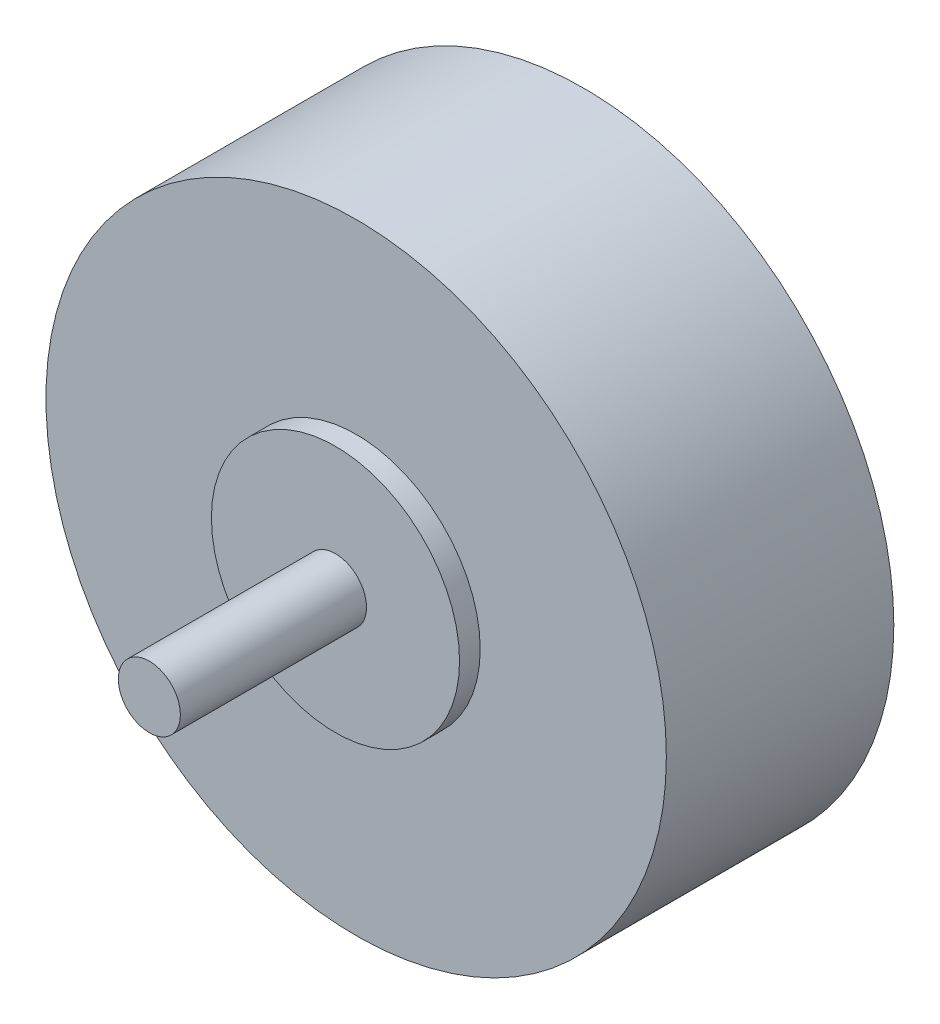
ISO-10303-21;
HEADER;
FILE_DESCRIPTION(('STEP AP214'),'2;1');
FILE_NAME('part.step','',(''),(''),'','','');
FILE_SCHEMA(('AUTOMOTIVE_DESIGN { 1 0 10303 214 1 1 1 1 }'));
ENDSEC;
DATA;
#1=APPLICATION_CONTEXT('core data for automotive mechanical design processes');
#2=APPLICATION_PROTOCOL_DEFINITION('international standard','automotive_design',2000,#1);
#3=PRODUCT_CONTEXT('',#1,'mechanical');
#4=PRODUCT('Part','Part','',(#3));
#5=PRODUCT_RELATED_PRODUCT_CATEGORY('part','',(#4));
#6=PRODUCT_DEFINITION_FORMATION('','',#4);
#7=PRODUCT_DEFINITION_CONTEXT('part definition',#1,'design');
#8=PRODUCT_DEFINITION('design','',#6,#7);
#9=PRODUCT_DEFINITION_SHAPE('','',#8);
#10=(LENGTH_UNIT() NAMED_UNIT(*) SI_UNIT(.MILLI.,.METRE.));
#11=(NAMED_UNIT(*) PLANE_ANGLE_UNIT() SI_UNIT($,.RADIAN.));
#12=(NAMED_UNIT(*) SI_UNIT($,.STERADIAN.) SOLID_ANGLE_UNIT());
#13=UNCERTAINTY_MEASURE_WITH_UNIT(LENGTH_MEASURE(1.E-05),#10,'distance_accuracy_value','');
#14=(GEOMETRIC_REPRESENTATION_CONTEXT(3) GLOBAL_UNCERTAINTY_ASSIGNED_CONTEXT((#13)) GLOBAL_UNIT_ASSIGNED_CONTEXT((#10,
#11,#12)) REPRESENTATION_CONTEXT('',''));
#15=CARTESIAN_POINT('',(0.,0.,0.));
#16=DIRECTION('',(0.,0.,1.));
#17=DIRECTION('',(1.,0.,0.));
#18=AXIS2_PLACEMENT_3D('',#15,#16,#17);
#19=CARTESIAN_POINT('',(0.,0.,5.5));
#20=DIRECTION('',(0.,0.,-1.));
#21=DIRECTION('',(-1.,0.,0.));
#22=AXIS2_PLACEMENT_3D('',#19,#20,#21);
#23=CYLINDRICAL_SURFACE('',#22,7.5);
#24=CARTESIAN_POINT('',(0.,0.,5.5));
#25=DIRECTION('',(0.,0.,1.));
#26=DIRECTION('',(1.,0.,0.));
#27=AXIS2_PLACEMENT_3D('',#24,#25,#26);
#28=CIRCLE('',#27,7.5);
#29=CARTESIAN_POINT('',(7.5,0.,5.5));
#30=VERTEX_POINT('',#29);
#31=EDGE_CURVE('E38',#30,#30,#28,.T.);
#32=ORIENTED_EDGE('',*,*,#31,.F.);
#33=EDGE_LOOP('',(#32));
#34=FACE_BOUND('',#33,.T.);
#35=CARTESIAN_POINT('',(0.,0.,0.));
#36=DIRECTION('',(0.,0.,1.));
#37=DIRECTION('',(1.,0.,0.));
#38=AXIS2_PLACEMENT_3D('',#35,#36,#37);
#39=CIRCLE('',#38,7.5);
#40=CARTESIAN_POINT('',(7.5,0.,0.));
#41=VERTEX_POINT('',#40);
#42=EDGE_CURVE('E42',#41,#41,#39,.T.);
#43=ORIENTED_EDGE('',*,*,#42,.T.);
#44=EDGE_LOOP('',(#43));
#45=FACE_BOUND('',#44,.T.);
#46=ADVANCED_FACE('F31',(#34,#45),#23,.T.);
#47=CARTESIAN_POINT('',(0.,0.,5.5));
#48=DIRECTION('',(0.,0.,1.));
#49=DIRECTION('',(1.,0.,0.));
#50=AXIS2_PLACEMENT_3D('',#47,#48,#49);
#51=PLANE('',#50);
#52=CARTESIAN_POINT('',(0.,0.,5.5));
#53=DIRECTION('',(0.,0.,1.));
#54=DIRECTION('',(1.,0.,0.));
#55=AXIS2_PLACEMENT_3D('',#52,#53,#54);
#56=CIRCLE('',#55,3.);
#57=CARTESIAN_POINT('',(3.,0.,5.5));
#58=VERTEX_POINT('',#57);
#59=EDGE_CURVE('E48',#58,#58,#56,.T.);
#60=ORIENTED_EDGE('',*,*,#59,.F.);
#61=EDGE_LOOP('',(#60));
#62=FACE_BOUND('',#61,.T.);
#63=ORIENTED_EDGE('',*,*,#31,.T.);
#64=EDGE_LOOP('',(#63));
#65=FACE_BOUND('',#64,.T.);
#66=ADVANCED_FACE('F85',(#62,#65),#51,.T.);
#67=CARTESIAN_POINT('',(0.,0.,0.));
#68=DIRECTION('',(0.,0.,1.));
#69=DIRECTION('',(1.,0.,0.));
#70=AXIS2_PLACEMENT_3D('',#67,#68,#69);
#71=PLANE('',#70);
#72=CARTESIAN_POINT('',(0.,0.,0.));
#73=DIRECTION('',(0.,0.,1.));
#74=DIRECTION('',(1.,0.,0.));
#75=AXIS2_PLACEMENT_3D('',#72,#73,#74);
#76=CIRCLE('',#75,2.);
#77=CARTESIAN_POINT('',(2.,0.,0.));
#78=VERTEX_POINT('',#77);
#79=EDGE_CURVE('E10',#78,#78,#76,.F.);
#80=ORIENTED_EDGE('',*,*,#79,.F.);
#81=EDGE_LOOP('',(#80));
#82=FACE_BOUND('',#81,.T.);
#83=ORIENTED_EDGE('',*,*,#42,.F.);
#84=EDGE_LOOP('',(#83));
#85=FACE_BOUND('',#84,.T.);
#86=ADVANCED_FACE('F90',(#82,#85),#71,.F.);
#87=CARTESIAN_POINT('',(0.,0.,6.));
#88=DIRECTION('',(0.,0.,-1.));
#89=DIRECTION('',(-1.,0.,0.));
#90=AXIS2_PLACEMENT_3D('',#87,#88,#89);
#91=CYLINDRICAL_SURFACE('',#90,3.);
#92=CARTESIAN_POINT('',(0.,0.,6.));
#93=DIRECTION('',(0.,0.,1.));
#94=DIRECTION('',(1.,0.,0.));
#95=AXIS2_PLACEMENT_3D('',#92,#93,#94);
#96=CIRCLE('',#95,3.);
#97=CARTESIAN_POINT('',(3.,0.,6.));
#98=VERTEX_POINT('',#97);
#99=EDGE_CURVE('E46',#98,#98,#96,.T.);
#100=ORIENTED_EDGE('',*,*,#99,.F.);
#101=EDGE_LOOP('',(#100));
#102=FACE_BOUND('',#101,.T.);
#103=ORIENTED_EDGE('',*,*,#59,.T.);
#104=EDGE_LOOP('',(#103));
#105=FACE_BOUND('',#104,.T.);
#106=ADVANCED_FACE('F98',(#102,#105),#91,.T.);
#107=CARTESIAN_POINT('',(0.,0.,6.));
#108=DIRECTION('',(0.,0.,1.));
#109=DIRECTION('',(1.,0.,0.));
#110=AXIS2_PLACEMENT_3D('',#107,#108,#109);
#111=PLANE('',#110);
#112=CARTESIAN_POINT('',(0.,0.,6.));
#113=DIRECTION('',(0.,0.,1.));
#114=DIRECTION('',(1.,0.,0.));
#115=AXIS2_PLACEMENT_3D('',#112,#113,#114);
#116=CIRCLE('',#115,0.75);
#117=CARTESIAN_POINT('',(0.75,0.,6.));
#118=VERTEX_POINT('',#117);
#119=EDGE_CURVE('E54',#118,#118,#116,.T.);
#120=ORIENTED_EDGE('',*,*,#119,.F.);
#121=EDGE_LOOP('',(#120));
#122=FACE_BOUND('',#121,.T.);
#123=ORIENTED_EDGE('',*,*,#99,.T.);
#124=EDGE_LOOP('',(#123));
#125=FACE_BOUND('',#124,.T.);
#126=ADVANCED_FACE('F103',(#122,#125),#111,.T.);
#127=CARTESIAN_POINT('',(0.,0.,10.5));
#128=DIRECTION('',(0.,0.,-1.));
#129=DIRECTION('',(-1.,0.,0.));
#130=AXIS2_PLACEMENT_3D('',#127,#128,#129);
#131=CYLINDRICAL_SURFACE('',#130,0.75);
#132=CARTESIAN_POINT('',(0.,0.,10.5));
#133=DIRECTION('',(0.,0.,1.));
#134=DIRECTION('',(1.,0.,0.));
#135=AXIS2_PLACEMENT_3D('',#132,#133,#134);
#136=CIRCLE('',#135,0.75);
#137=CARTESIAN_POINT('',(0.75,0.,10.5));
#138=VERTEX_POINT('',#137);
#139=EDGE_CURVE('E51',#138,#138,#136,.T.);
#140=ORIENTED_EDGE('',*,*,#139,.F.);
#141=EDGE_LOOP('',(#140));
#142=FACE_BOUND('',#141,.T.);
#143=ORIENTED_EDGE('',*,*,#119,.T.);
#144=EDGE_LOOP('',(#143));
#145=FACE_BOUND('',#144,.T.);
#146=ADVANCED_FACE('F109',(#142,#145),#131,.T.);
#147=CARTESIAN_POINT('',(0.,0.,10.5));
#148=DIRECTION('',(0.,0.,1.));
#149=DIRECTION('',(1.,0.,0.));
#150=AXIS2_PLACEMENT_3D('',#147,#148,#149);
#151=PLANE('',#150);
#152=ORIENTED_EDGE('',*,*,#139,.T.);
#153=EDGE_LOOP('',(#152));
#154=FACE_BOUND('',#153,.T.);
#155=ADVANCED_FACE('F113',(#154),#151,.T.);
#156=CARTESIAN_POINT('',(0.,0.,-1.4));
#157=DIRECTION('',(0.,0.,1.));
#158=DIRECTION('',(1.,0.,0.));
#159=AXIS2_PLACEMENT_3D('',#156,#157,#158);
#160=CYLINDRICAL_SURFACE('',#159,2.);
#161=CARTESIAN_POINT('',(0.,0.,-1.4));
#162=DIRECTION('',(0.,0.,-1.));
#163=DIRECTION('',(-1.,0.,0.));
#164=AXIS2_PLACEMENT_3D('',#161,#162,#163);
#165=CIRCLE('',#164,2.);
#166=CARTESIAN_POINT('',(-2.,0.,-1.4));
#167=VERTEX_POINT('',#166);
#168=EDGE_CURVE('E57',#167,#167,#165,.T.);
#169=ORIENTED_EDGE('',*,*,#168,.F.);
#170=EDGE_LOOP('',(#169));
#171=FACE_BOUND('',#170,.T.);
#172=ORIENTED_EDGE('',*,*,#79,.T.);
#173=EDGE_LOOP('',(#172));
#174=FACE_BOUND('',#173,.T.);
#175=ADVANCED_FACE('F82',(#171,#174),#160,.T.);
#176=CARTESIAN_POINT('',(0.,0.,-1.4));
#177=DIRECTION('',(0.,0.,-1.));
#178=DIRECTION('',(-1.,0.,0.));
#179=AXIS2_PLACEMENT_3D('',#176,#177,#178);
#180=PLANE('',#179);
#181=CARTESIAN_POINT('',(0.,0.,-1.4));
#182=DIRECTION('',(0.,0.,-1.));
#183=DIRECTION('',(-1.,0.,0.));
#184=AXIS2_PLACEMENT_3D('',#181,#182,#183);
#185=CIRCLE('',#184,0.75);
#186=CARTESIAN_POINT('',(-0.75,0.,-1.4));
#187=VERTEX_POINT('',#186);
#188=EDGE_CURVE('E34',#187,#187,#185,.F.);
#189=ORIENTED_EDGE('',*,*,#188,.T.);
#190=EDGE_LOOP('',(#189));
#191=FACE_BOUND('',#190,.T.);
#192=ORIENTED_EDGE('',*,*,#168,.T.);
#193=EDGE_LOOP('',(#192));
#194=FACE_BOUND('',#193,.T.);
#195=ADVANCED_FACE('F69',(#191,#194),#180,.T.);
#196=CARTESIAN_POINT('',(0.,0.,-4.));
#197=DIRECTION('',(0.,0.,1.));
#198=DIRECTION('',(1.,0.,0.));
#199=AXIS2_PLACEMENT_3D('',#196,#197,#198);
#200=CYLINDRICAL_SURFACE('',#199,0.75);
#201=ORIENTED_EDGE('',*,*,#188,.F.);
#202=EDGE_LOOP('',(#201));
#203=FACE_BOUND('',#202,.T.);
#204=CARTESIAN_POINT('',(0.,0.,-4.));
#205=DIRECTION('',(0.,0.,-1.));
#206=DIRECTION('',(-1.,0.,0.));
#207=AXIS2_PLACEMENT_3D('',#204,#205,#206);
#208=CIRCLE('',#207,0.75);
#209=CARTESIAN_POINT('',(-0.75,0.,-4.));
#210=VERTEX_POINT('',#209);
#211=EDGE_CURVE('E62',#210,#210,#208,.T.);
#212=ORIENTED_EDGE('',*,*,#211,.F.);
#213=EDGE_LOOP('',(#212));
#214=FACE_BOUND('',#213,.T.);
#215=ADVANCED_FACE('F72',(#203,#214),#200,.T.);
#216=CARTESIAN_POINT('',(0.,0.,-4.));
#217=DIRECTION('',(0.,0.,-1.));
#218=DIRECTION('',(-1.,0.,0.));
#219=AXIS2_PLACEMENT_3D('',#216,#217,#218);
#220=PLANE('',#219);
#221=ORIENTED_EDGE('',*,*,#211,.T.);
#222=EDGE_LOOP('',(#221));
#223=FACE_BOUND('',#222,.T.);
#224=ADVANCED_FACE('F75',(#223),#220,.T.);
#225=CLOSED_SHELL('',(#46,#66,#86,#106,#126,#146,#155,#175,#195,#215,#224));
#226=MANIFOLD_SOLID_BREP('B2',#225);
#227=ADVANCED_BREP_SHAPE_REPRESENTATION('',(#18,#226),#14);
#228=SHAPE_DEFINITION_REPRESENTATION(#9,#227);
ENDSEC;
END-ISO-10303-21;
